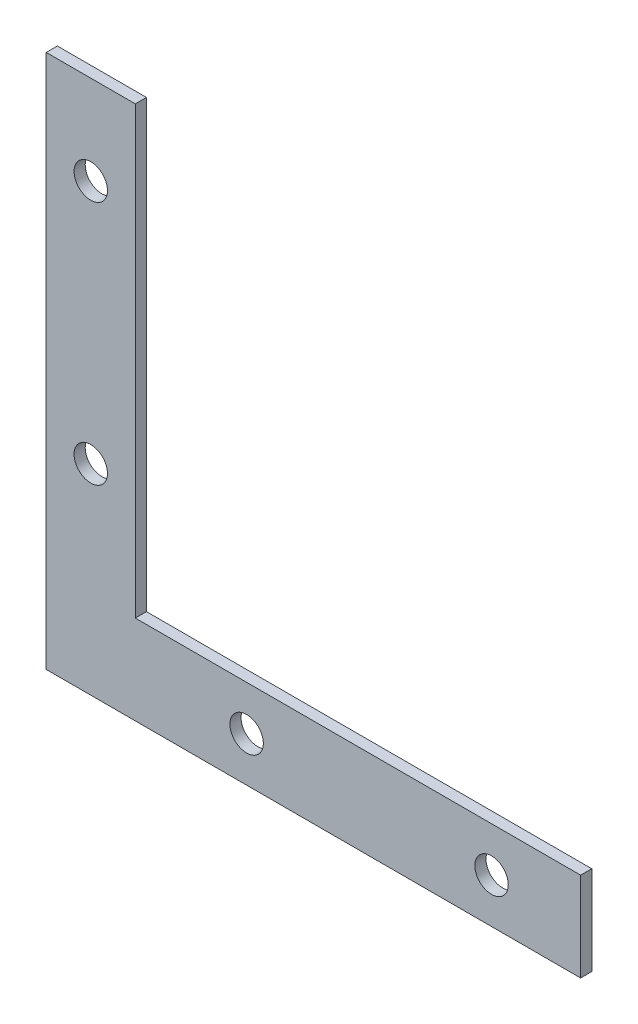
ISO-10303-21;
HEADER;
FILE_DESCRIPTION(('STEP AP214'),'2;1');
FILE_NAME('part.step','',(''),(''),'','','');
FILE_SCHEMA(('AUTOMOTIVE_DESIGN { 1 0 10303 214 1 1 1 1 }'));
ENDSEC;
DATA;
#1=APPLICATION_CONTEXT('core data for automotive mechanical design processes');
#2=APPLICATION_PROTOCOL_DEFINITION('international standard','automotive_design',2000,#1);
#3=PRODUCT_CONTEXT('',#1,'mechanical');
#4=PRODUCT('Part','Part','',(#3));
#5=PRODUCT_RELATED_PRODUCT_CATEGORY('part','',(#4));
#6=PRODUCT_DEFINITION_FORMATION('','',#4);
#7=PRODUCT_DEFINITION_CONTEXT('part definition',#1,'design');
#8=PRODUCT_DEFINITION('design','',#6,#7);
#9=PRODUCT_DEFINITION_SHAPE('','',#8);
#10=(LENGTH_UNIT() NAMED_UNIT(*) SI_UNIT(.MILLI.,.METRE.));
#11=(NAMED_UNIT(*) PLANE_ANGLE_UNIT() SI_UNIT($,.RADIAN.));
#12=(NAMED_UNIT(*) SI_UNIT($,.STERADIAN.) SOLID_ANGLE_UNIT());
#13=UNCERTAINTY_MEASURE_WITH_UNIT(LENGTH_MEASURE(1.E-05),#10,'distance_accuracy_value','');
#14=(GEOMETRIC_REPRESENTATION_CONTEXT(3) GLOBAL_UNCERTAINTY_ASSIGNED_CONTEXT((#13)) GLOBAL_UNIT_ASSIGNED_CONTEXT((#10,
#11,#12)) REPRESENTATION_CONTEXT('',''));
#15=CARTESIAN_POINT('',(0.,0.,0.));
#16=DIRECTION('',(0.,0.,1.));
#17=DIRECTION('',(1.,0.,0.));
#18=AXIS2_PLACEMENT_3D('',#15,#16,#17);
#19=CARTESIAN_POINT('',(0.,0.,1.5875));
#20=DIRECTION('',(0.,0.,-1.));
#21=DIRECTION('',(-1.,0.,0.));
#22=AXIS2_PLACEMENT_3D('',#19,#20,#21);
#23=PLANE('',#22);
#24=CARTESIAN_POINT('',(6.35000000000009,63.5,1.5875));
#25=DIRECTION('',(0.,0.,1.));
#26=DIRECTION('',(-1.,0.,0.));
#27=AXIS2_PLACEMENT_3D('',#24,#25,#26);
#28=CIRCLE('',#27,2.38124999999998);
#29=CARTESIAN_POINT('',(3.96875000000011,63.5,1.5875));
#30=VERTEX_POINT('',#29);
#31=EDGE_CURVE('E190',#30,#30,#28,.T.);
#32=ORIENTED_EDGE('',*,*,#31,.F.);
#33=EDGE_LOOP('',(#32));
#34=FACE_BOUND('',#33,.T.);
#35=CARTESIAN_POINT('',(63.5,6.35,1.5875));
#36=DIRECTION('',(0.,0.,1.));
#37=DIRECTION('',(1.,0.,0.));
#38=AXIS2_PLACEMENT_3D('',#35,#36,#37);
#39=CIRCLE('',#38,2.38125000000001);
#40=CARTESIAN_POINT('',(65.88125,6.35,1.5875));
#41=VERTEX_POINT('',#40);
#42=EDGE_CURVE('E122',#41,#41,#39,.T.);
#43=ORIENTED_EDGE('',*,*,#42,.F.);
#44=EDGE_LOOP('',(#43));
#45=FACE_BOUND('',#44,.T.);
#46=DIRECTION('',(1.,0.,0.));
#47=VECTOR('',#46,1.);
#48=CARTESIAN_POINT('',(76.2,0.,1.5875));
#49=LINE('',#48,#47);
#50=CARTESIAN_POINT('',(0.,0.,1.5875));
#51=VERTEX_POINT('',#50);
#52=CARTESIAN_POINT('',(76.2,0.,1.5875));
#53=VERTEX_POINT('',#52);
#54=EDGE_CURVE('E129',#51,#53,#49,.T.);
#55=ORIENTED_EDGE('',*,*,#54,.T.);
#56=DIRECTION('',(0.,1.,0.));
#57=VECTOR('',#56,1.);
#58=CARTESIAN_POINT('',(76.2,12.7,1.5875));
#59=LINE('',#58,#57);
#60=CARTESIAN_POINT('',(76.2,12.7,1.5875));
#61=VERTEX_POINT('',#60);
#62=EDGE_CURVE('E87',#53,#61,#59,.T.);
#63=ORIENTED_EDGE('',*,*,#62,.T.);
#64=DIRECTION('',(-1.,0.,0.));
#65=VECTOR('',#64,1.);
#66=CARTESIAN_POINT('',(12.7,12.7,1.5875));
#67=LINE('',#66,#65);
#68=CARTESIAN_POINT('',(12.7,12.7,1.5875));
#69=VERTEX_POINT('',#68);
#70=EDGE_CURVE('E100',#61,#69,#67,.T.);
#71=ORIENTED_EDGE('',*,*,#70,.T.);
#72=DIRECTION('',(0.,1.,0.));
#73=VECTOR('',#72,1.);
#74=CARTESIAN_POINT('',(12.7,76.2,1.5875));
#75=LINE('',#74,#73);
#76=CARTESIAN_POINT('',(12.7,76.2,1.5875));
#77=VERTEX_POINT('',#76);
#78=EDGE_CURVE('E94',#69,#77,#75,.T.);
#79=ORIENTED_EDGE('',*,*,#78,.T.);
#80=DIRECTION('',(-1.,0.,0.));
#81=VECTOR('',#80,1.);
#82=CARTESIAN_POINT('',(0.,76.2,1.5875));
#83=LINE('',#82,#81);
#84=CARTESIAN_POINT('',(0.,76.2,1.5875));
#85=VERTEX_POINT('',#84);
#86=EDGE_CURVE('E98',#77,#85,#83,.T.);
#87=ORIENTED_EDGE('',*,*,#86,.T.);
#88=DIRECTION('',(0.,-1.,0.));
#89=VECTOR('',#88,1.);
#90=CARTESIAN_POINT('',(0.,0.,1.5875));
#91=LINE('',#90,#89);
#92=EDGE_CURVE('E50',#85,#51,#91,.T.);
#93=ORIENTED_EDGE('',*,*,#92,.T.);
#94=EDGE_LOOP('',(#55,#63,#71,#79,#87,#93));
#95=FACE_BOUND('',#94,.T.);
#96=CARTESIAN_POINT('',(28.575,6.34999999999999,1.5875));
#97=DIRECTION('',(0.,0.,1.));
#98=DIRECTION('',(1.,0.,0.));
#99=AXIS2_PLACEMENT_3D('',#96,#97,#98);
#100=CIRCLE('',#99,2.38125);
#101=CARTESIAN_POINT('',(30.95625,6.34999999999999,1.5875));
#102=VERTEX_POINT('',#101);
#103=EDGE_CURVE('E196',#102,#102,#100,.T.);
#104=ORIENTED_EDGE('',*,*,#103,.F.);
#105=EDGE_LOOP('',(#104));
#106=FACE_BOUND('',#105,.T.);
#107=CARTESIAN_POINT('',(6.35000000000004,28.575,1.5875));
#108=DIRECTION('',(0.,0.,1.));
#109=DIRECTION('',(-1.,0.,0.));
#110=AXIS2_PLACEMENT_3D('',#107,#108,#109);
#111=CIRCLE('',#110,2.38125);
#112=CARTESIAN_POINT('',(3.96875000000004,28.575,1.5875));
#113=VERTEX_POINT('',#112);
#114=EDGE_CURVE('E181',#113,#113,#111,.T.);
#115=ORIENTED_EDGE('',*,*,#114,.F.);
#116=EDGE_LOOP('',(#115));
#117=FACE_BOUND('',#116,.T.);
#118=ADVANCED_FACE('F33',(#34,#45,#95,#106,#117),#23,.F.);
#119=CARTESIAN_POINT('',(0.,0.,0.));
#120=DIRECTION('',(0.,0.,-1.));
#121=DIRECTION('',(-1.,0.,0.));
#122=AXIS2_PLACEMENT_3D('',#119,#120,#121);
#123=PLANE('',#122);
#124=CARTESIAN_POINT('',(6.35000000000009,63.5,0.));
#125=DIRECTION('',(0.,0.,1.));
#126=DIRECTION('',(-1.,0.,0.));
#127=AXIS2_PLACEMENT_3D('',#124,#125,#126);
#128=CIRCLE('',#127,2.38124999999998);
#129=CARTESIAN_POINT('',(3.96875000000011,63.5,0.));
#130=VERTEX_POINT('',#129);
#131=EDGE_CURVE('E187',#130,#130,#128,.T.);
#132=ORIENTED_EDGE('',*,*,#131,.T.);
#133=EDGE_LOOP('',(#132));
#134=FACE_BOUND('',#133,.T.);
#135=CARTESIAN_POINT('',(63.5,6.35,0.));
#136=DIRECTION('',(0.,0.,1.));
#137=DIRECTION('',(1.,0.,0.));
#138=AXIS2_PLACEMENT_3D('',#135,#136,#137);
#139=CIRCLE('',#138,2.38125000000001);
#140=CARTESIAN_POINT('',(65.88125,6.35,0.));
#141=VERTEX_POINT('',#140);
#142=EDGE_CURVE('E199',#141,#141,#139,.T.);
#143=ORIENTED_EDGE('',*,*,#142,.T.);
#144=EDGE_LOOP('',(#143));
#145=FACE_BOUND('',#144,.T.);
#146=DIRECTION('',(1.,0.,0.));
#147=VECTOR('',#146,1.);
#148=CARTESIAN_POINT('',(76.2,0.,0.));
#149=LINE('',#148,#147);
#150=CARTESIAN_POINT('',(0.,0.,0.));
#151=VERTEX_POINT('',#150);
#152=CARTESIAN_POINT('',(76.2,0.,0.));
#153=VERTEX_POINT('',#152);
#154=EDGE_CURVE('E118',#151,#153,#149,.T.);
#155=ORIENTED_EDGE('',*,*,#154,.F.);
#156=DIRECTION('',(0.,-1.,0.));
#157=VECTOR('',#156,1.);
#158=CARTESIAN_POINT('',(0.,0.,0.));
#159=LINE('',#158,#157);
#160=CARTESIAN_POINT('',(0.,76.2,0.));
#161=VERTEX_POINT('',#160);
#162=EDGE_CURVE('E79',#161,#151,#159,.T.);
#163=ORIENTED_EDGE('',*,*,#162,.F.);
#164=DIRECTION('',(-1.,0.,0.));
#165=VECTOR('',#164,1.);
#166=CARTESIAN_POINT('',(0.,76.2,0.));
#167=LINE('',#166,#165);
#168=CARTESIAN_POINT('',(12.7,76.2,0.));
#169=VERTEX_POINT('',#168);
#170=EDGE_CURVE('E73',#169,#161,#167,.T.);
#171=ORIENTED_EDGE('',*,*,#170,.F.);
#172=DIRECTION('',(0.,1.,0.));
#173=VECTOR('',#172,1.);
#174=CARTESIAN_POINT('',(12.7,76.2,0.));
#175=LINE('',#174,#173);
#176=CARTESIAN_POINT('',(12.7,12.7,0.));
#177=VERTEX_POINT('',#176);
#178=EDGE_CURVE('E108',#177,#169,#175,.T.);
#179=ORIENTED_EDGE('',*,*,#178,.F.);
#180=DIRECTION('',(-1.,0.,0.));
#181=VECTOR('',#180,1.);
#182=CARTESIAN_POINT('',(12.7,12.7,0.));
#183=LINE('',#182,#181);
#184=CARTESIAN_POINT('',(76.2,12.7,0.));
#185=VERTEX_POINT('',#184);
#186=EDGE_CURVE('E124',#185,#177,#183,.T.);
#187=ORIENTED_EDGE('',*,*,#186,.F.);
#188=DIRECTION('',(0.,1.,0.));
#189=VECTOR('',#188,1.);
#190=CARTESIAN_POINT('',(76.2,12.7,0.));
#191=LINE('',#190,#189);
#192=EDGE_CURVE('E121',#153,#185,#191,.T.);
#193=ORIENTED_EDGE('',*,*,#192,.F.);
#194=EDGE_LOOP('',(#155,#163,#171,#179,#187,#193));
#195=FACE_BOUND('',#194,.T.);
#196=CARTESIAN_POINT('',(28.575,6.34999999999999,0.));
#197=DIRECTION('',(0.,0.,1.));
#198=DIRECTION('',(1.,0.,0.));
#199=AXIS2_PLACEMENT_3D('',#196,#197,#198);
#200=CIRCLE('',#199,2.38125);
#201=CARTESIAN_POINT('',(30.95625,6.34999999999999,0.));
#202=VERTEX_POINT('',#201);
#203=EDGE_CURVE('E193',#202,#202,#200,.T.);
#204=ORIENTED_EDGE('',*,*,#203,.T.);
#205=EDGE_LOOP('',(#204));
#206=FACE_BOUND('',#205,.T.);
#207=CARTESIAN_POINT('',(6.35000000000004,28.575,0.));
#208=DIRECTION('',(0.,0.,1.));
#209=DIRECTION('',(-1.,0.,0.));
#210=AXIS2_PLACEMENT_3D('',#207,#208,#209);
#211=CIRCLE('',#210,2.38125);
#212=CARTESIAN_POINT('',(3.96875000000004,28.575,0.));
#213=VERTEX_POINT('',#212);
#214=EDGE_CURVE('E184',#213,#213,#211,.T.);
#215=ORIENTED_EDGE('',*,*,#214,.T.);
#216=EDGE_LOOP('',(#215));
#217=FACE_BOUND('',#216,.T.);
#218=ADVANCED_FACE('F138',(#134,#145,#195,#206,#217),#123,.T.);
#219=CARTESIAN_POINT('',(76.2,0.,1.5875));
#220=DIRECTION('',(0.,1.,0.));
#221=DIRECTION('',(-1.,0.,0.));
#222=AXIS2_PLACEMENT_3D('',#219,#220,#221);
#223=PLANE('',#222);
#224=ORIENTED_EDGE('',*,*,#154,.T.);
#225=DIRECTION('',(0.,0.,-1.));
#226=VECTOR('',#225,1.);
#227=CARTESIAN_POINT('',(76.2,0.,1.5875));
#228=LINE('',#227,#226);
#229=EDGE_CURVE('E11',#53,#153,#228,.T.);
#230=ORIENTED_EDGE('',*,*,#229,.F.);
#231=ORIENTED_EDGE('',*,*,#54,.F.);
#232=DIRECTION('',(0.,0.,-1.));
#233=VECTOR('',#232,1.);
#234=CARTESIAN_POINT('',(0.,0.,1.5875));
#235=LINE('',#234,#233);
#236=EDGE_CURVE('E114',#51,#151,#235,.T.);
#237=ORIENTED_EDGE('',*,*,#236,.T.);
#238=EDGE_LOOP('',(#224,#230,#231,#237));
#239=FACE_BOUND('',#238,.T.);
#240=ADVANCED_FACE('F35',(#239),#223,.F.);
#241=CARTESIAN_POINT('',(76.2,12.7,1.5875));
#242=DIRECTION('',(-1.,0.,0.));
#243=DIRECTION('',(0.,0.,1.));
#244=AXIS2_PLACEMENT_3D('',#241,#242,#243);
#245=PLANE('',#244);
#246=ORIENTED_EDGE('',*,*,#192,.T.);
#247=DIRECTION('',(0.,0.,-1.));
#248=VECTOR('',#247,1.);
#249=CARTESIAN_POINT('',(76.2,12.7,1.5875));
#250=LINE('',#249,#248);
#251=EDGE_CURVE('E42',#61,#185,#250,.T.);
#252=ORIENTED_EDGE('',*,*,#251,.F.);
#253=ORIENTED_EDGE('',*,*,#62,.F.);
#254=ORIENTED_EDGE('',*,*,#229,.T.);
#255=EDGE_LOOP('',(#246,#252,#253,#254));
#256=FACE_BOUND('',#255,.T.);
#257=ADVANCED_FACE('F256',(#256),#245,.F.);
#258=CARTESIAN_POINT('',(12.7,12.7,1.5875));
#259=DIRECTION('',(0.,-1.,0.));
#260=DIRECTION('',(0.,0.,-1.));
#261=AXIS2_PLACEMENT_3D('',#258,#259,#260);
#262=PLANE('',#261);
#263=ORIENTED_EDGE('',*,*,#186,.T.);
#264=DIRECTION('',(0.,0.,-1.));
#265=VECTOR('',#264,1.);
#266=CARTESIAN_POINT('',(12.7,12.7,1.5875));
#267=LINE('',#266,#265);
#268=EDGE_CURVE('E109',#69,#177,#267,.T.);
#269=ORIENTED_EDGE('',*,*,#268,.F.);
#270=ORIENTED_EDGE('',*,*,#70,.F.);
#271=ORIENTED_EDGE('',*,*,#251,.T.);
#272=EDGE_LOOP('',(#263,#269,#270,#271));
#273=FACE_BOUND('',#272,.T.);
#274=ADVANCED_FACE('F135',(#273),#262,.F.);
#275=CARTESIAN_POINT('',(12.7,76.2,1.5875));
#276=DIRECTION('',(-1.,0.,0.));
#277=DIRECTION('',(0.,-1.,0.));
#278=AXIS2_PLACEMENT_3D('',#275,#276,#277);
#279=PLANE('',#278);
#280=ORIENTED_EDGE('',*,*,#178,.T.);
#281=DIRECTION('',(0.,0.,-1.));
#282=VECTOR('',#281,1.);
#283=CARTESIAN_POINT('',(12.7,76.2,1.5875));
#284=LINE('',#283,#282);
#285=EDGE_CURVE('E105',#77,#169,#284,.T.);
#286=ORIENTED_EDGE('',*,*,#285,.F.);
#287=ORIENTED_EDGE('',*,*,#78,.F.);
#288=ORIENTED_EDGE('',*,*,#268,.T.);
#289=EDGE_LOOP('',(#280,#286,#287,#288));
#290=FACE_BOUND('',#289,.T.);
#291=ADVANCED_FACE('F106',(#290),#279,.F.);
#292=CARTESIAN_POINT('',(0.,76.2,1.5875));
#293=DIRECTION('',(0.,-1.,0.));
#294=DIRECTION('',(0.,0.,-1.));
#295=AXIS2_PLACEMENT_3D('',#292,#293,#294);
#296=PLANE('',#295);
#297=ORIENTED_EDGE('',*,*,#170,.T.);
#298=DIRECTION('',(0.,0.,-1.));
#299=VECTOR('',#298,1.);
#300=CARTESIAN_POINT('',(0.,76.2,1.5875));
#301=LINE('',#300,#299);
#302=EDGE_CURVE('E110',#85,#161,#301,.T.);
#303=ORIENTED_EDGE('',*,*,#302,.F.);
#304=ORIENTED_EDGE('',*,*,#86,.F.);
#305=ORIENTED_EDGE('',*,*,#285,.T.);
#306=EDGE_LOOP('',(#297,#303,#304,#305));
#307=FACE_BOUND('',#306,.T.);
#308=ADVANCED_FACE('F112',(#307),#296,.F.);
#309=CARTESIAN_POINT('',(0.,0.,1.5875));
#310=DIRECTION('',(1.,0.,0.));
#311=DIRECTION('',(0.,0.,-1.));
#312=AXIS2_PLACEMENT_3D('',#309,#310,#311);
#313=PLANE('',#312);
#314=ORIENTED_EDGE('',*,*,#162,.T.);
#315=ORIENTED_EDGE('',*,*,#236,.F.);
#316=ORIENTED_EDGE('',*,*,#92,.F.);
#317=ORIENTED_EDGE('',*,*,#302,.T.);
#318=EDGE_LOOP('',(#314,#315,#316,#317));
#319=FACE_BOUND('',#318,.T.);
#320=ADVANCED_FACE('F143',(#319),#313,.F.);
#321=CARTESIAN_POINT('',(63.5,6.35,1.5875));
#322=DIRECTION('',(0.,0.,-1.));
#323=DIRECTION('',(-1.,0.,0.));
#324=AXIS2_PLACEMENT_3D('',#321,#322,#323);
#325=CYLINDRICAL_SURFACE('',#324,2.38125000000001);
#326=ORIENTED_EDGE('',*,*,#42,.T.);
#327=EDGE_LOOP('',(#326));
#328=FACE_BOUND('',#327,.T.);
#329=ORIENTED_EDGE('',*,*,#142,.F.);
#330=EDGE_LOOP('',(#329));
#331=FACE_BOUND('',#330,.T.);
#332=ADVANCED_FACE('F145',(#328,#331),#325,.F.);
#333=CARTESIAN_POINT('',(28.575,6.34999999999999,1.5875));
#334=DIRECTION('',(0.,0.,-1.));
#335=DIRECTION('',(-1.,0.,0.));
#336=AXIS2_PLACEMENT_3D('',#333,#334,#335);
#337=CYLINDRICAL_SURFACE('',#336,2.38125);
#338=ORIENTED_EDGE('',*,*,#103,.T.);
#339=EDGE_LOOP('',(#338));
#340=FACE_BOUND('',#339,.T.);
#341=ORIENTED_EDGE('',*,*,#203,.F.);
#342=EDGE_LOOP('',(#341));
#343=FACE_BOUND('',#342,.T.);
#344=ADVANCED_FACE('F151',(#340,#343),#337,.F.);
#345=CARTESIAN_POINT('',(6.35000000000009,63.5,1.5875));
#346=DIRECTION('',(0.,0.,-1.));
#347=DIRECTION('',(-1.,0.,0.));
#348=AXIS2_PLACEMENT_3D('',#345,#346,#347);
#349=CYLINDRICAL_SURFACE('',#348,2.38124999999998);
#350=ORIENTED_EDGE('',*,*,#31,.T.);
#351=EDGE_LOOP('',(#350));
#352=FACE_BOUND('',#351,.T.);
#353=ORIENTED_EDGE('',*,*,#131,.F.);
#354=EDGE_LOOP('',(#353));
#355=FACE_BOUND('',#354,.T.);
#356=ADVANCED_FACE('F168',(#352,#355),#349,.F.);
#357=CARTESIAN_POINT('',(6.35000000000004,28.575,1.5875));
#358=DIRECTION('',(0.,0.,-1.));
#359=DIRECTION('',(-1.,0.,0.));
#360=AXIS2_PLACEMENT_3D('',#357,#358,#359);
#361=CYLINDRICAL_SURFACE('',#360,2.38125);
#362=ORIENTED_EDGE('',*,*,#114,.T.);
#363=EDGE_LOOP('',(#362));
#364=FACE_BOUND('',#363,.T.);
#365=ORIENTED_EDGE('',*,*,#214,.F.);
#366=EDGE_LOOP('',(#365));
#367=FACE_BOUND('',#366,.T.);
#368=ADVANCED_FACE('F172',(#364,#367),#361,.F.);
#369=CLOSED_SHELL('',(#118,#218,#240,#257,#274,#291,#308,#320,#332,#344,#356,#368));
#370=MANIFOLD_SOLID_BREP('B2',#369);
#371=ADVANCED_BREP_SHAPE_REPRESENTATION('',(#18,#370),#14);
#372=SHAPE_DEFINITION_REPRESENTATION(#9,#371);
ENDSEC;
END-ISO-10303-21;
